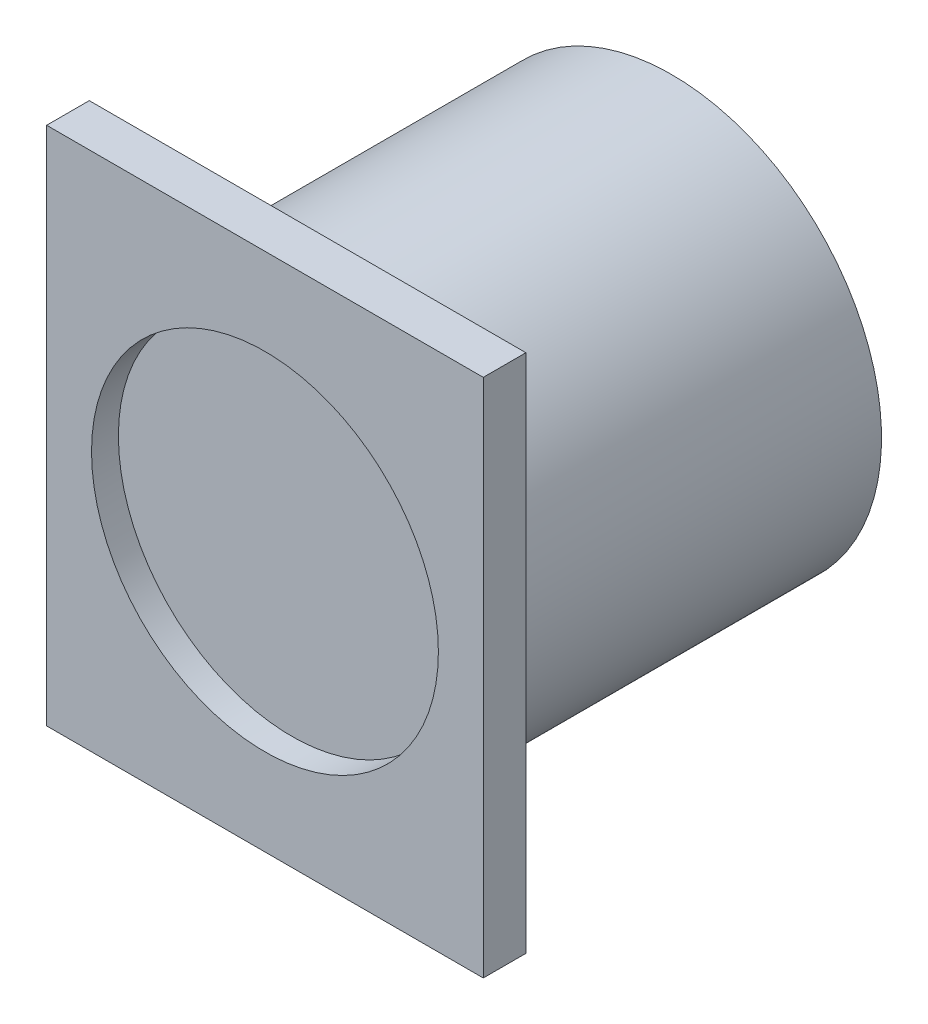
ISO-10303-21;
HEADER;
FILE_DESCRIPTION(('STEP AP214'),'2;1');
FILE_NAME('part.step','',(''),(''),'','','');
FILE_SCHEMA(('AUTOMOTIVE_DESIGN { 1 0 10303 214 1 1 1 1 }'));
ENDSEC;
DATA;
#1=APPLICATION_CONTEXT('core data for automotive mechanical design processes');
#2=APPLICATION_PROTOCOL_DEFINITION('international standard','automotive_design',2000,#1);
#3=PRODUCT_CONTEXT('',#1,'mechanical');
#4=PRODUCT('Part','Part','',(#3));
#5=PRODUCT_RELATED_PRODUCT_CATEGORY('part','',(#4));
#6=PRODUCT_DEFINITION_FORMATION('','',#4);
#7=PRODUCT_DEFINITION_CONTEXT('part definition',#1,'design');
#8=PRODUCT_DEFINITION('design','',#6,#7);
#9=PRODUCT_DEFINITION_SHAPE('','',#8);
#10=(LENGTH_UNIT() NAMED_UNIT(*) SI_UNIT(.MILLI.,.METRE.));
#11=(NAMED_UNIT(*) PLANE_ANGLE_UNIT() SI_UNIT($,.RADIAN.));
#12=(NAMED_UNIT(*) SI_UNIT($,.STERADIAN.) SOLID_ANGLE_UNIT());
#13=UNCERTAINTY_MEASURE_WITH_UNIT(LENGTH_MEASURE(1.E-05),#10,'distance_accuracy_value','');
#14=(GEOMETRIC_REPRESENTATION_CONTEXT(3) GLOBAL_UNCERTAINTY_ASSIGNED_CONTEXT((#13)) GLOBAL_UNIT_ASSIGNED_CONTEXT((#10,
#11,#12)) REPRESENTATION_CONTEXT('',''));
#15=CARTESIAN_POINT('',(0.,0.,0.));
#16=DIRECTION('',(0.,0.,1.));
#17=DIRECTION('',(1.,0.,0.));
#18=AXIS2_PLACEMENT_3D('',#15,#16,#17);
#19=CARTESIAN_POINT('',(0.,0.,0.9398));
#20=DIRECTION('',(0.,0.,1.));
#21=DIRECTION('',(1.,0.,0.));
#22=AXIS2_PLACEMENT_3D('',#19,#20,#21);
#23=PLANE('',#22);
#24=CARTESIAN_POINT('',(13.0048,15.494,0.9398));
#25=DIRECTION('',(0.,0.,1.));
#26=DIRECTION('',(1.,0.,0.));
#27=AXIS2_PLACEMENT_3D('',#24,#25,#26);
#28=CIRCLE('',#27,10.3313154429818);
#29=CARTESIAN_POINT('',(23.3361154429818,15.494,0.9398));
#30=VERTEX_POINT('',#29);
#31=EDGE_CURVE('E20',#30,#30,#28,.T.);
#32=ORIENTED_EDGE('',*,*,#31,.T.);
#33=EDGE_LOOP('',(#32));
#34=FACE_BOUND('',#33,.T.);
#35=ADVANCED_FACE('F17',(#34),#23,.T.);
#36=CARTESIAN_POINT('',(13.0048,15.494,2.54));
#37=DIRECTION('',(0.,0.,1.));
#38=DIRECTION('',(1.,0.,0.));
#39=AXIS2_PLACEMENT_3D('',#36,#37,#38);
#40=CYLINDRICAL_SURFACE('',#39,10.3313154429818);
#41=ORIENTED_EDGE('',*,*,#31,.F.);
#42=EDGE_LOOP('',(#41));
#43=FACE_BOUND('',#42,.T.);
#44=CARTESIAN_POINT('',(13.0048,15.494,2.54));
#45=DIRECTION('',(0.,0.,1.));
#46=DIRECTION('',(1.,0.,0.));
#47=AXIS2_PLACEMENT_3D('',#44,#45,#46);
#48=CIRCLE('',#47,10.3313154429818);
#49=CARTESIAN_POINT('',(23.3361154429818,15.494,2.54));
#50=VERTEX_POINT('',#49);
#51=EDGE_CURVE('E66',#50,#50,#48,.F.);
#52=ORIENTED_EDGE('',*,*,#51,.F.);
#53=EDGE_LOOP('',(#52));
#54=FACE_BOUND('',#53,.T.);
#55=ADVANCED_FACE('F92',(#43,#54),#40,.F.);
#56=CARTESIAN_POINT('',(0.,0.,2.54));
#57=DIRECTION('',(0.,0.,1.));
#58=DIRECTION('',(1.,0.,0.));
#59=AXIS2_PLACEMENT_3D('',#56,#57,#58);
#60=PLANE('',#59);
#61=ORIENTED_EDGE('',*,*,#51,.T.);
#62=EDGE_LOOP('',(#61));
#63=FACE_BOUND('',#62,.T.);
#64=DIRECTION('',(1.,0.,0.));
#65=VECTOR('',#64,1.);
#66=CARTESIAN_POINT('',(26.0096,30.988,2.54));
#67=LINE('',#66,#65);
#68=CARTESIAN_POINT('',(0.,30.988,2.54));
#69=VERTEX_POINT('',#68);
#70=CARTESIAN_POINT('',(26.0096,30.988,2.54));
#71=VERTEX_POINT('',#70);
#72=EDGE_CURVE('E63',#69,#71,#67,.T.);
#73=ORIENTED_EDGE('',*,*,#72,.F.);
#74=DIRECTION('',(0.,1.,0.));
#75=VECTOR('',#74,1.);
#76=CARTESIAN_POINT('',(0.,30.988,2.54));
#77=LINE('',#76,#75);
#78=CARTESIAN_POINT('',(0.,0.,2.54));
#79=VERTEX_POINT('',#78);
#80=EDGE_CURVE('E59',#79,#69,#77,.T.);
#81=ORIENTED_EDGE('',*,*,#80,.F.);
#82=DIRECTION('',(1.,0.,0.));
#83=VECTOR('',#82,1.);
#84=CARTESIAN_POINT('',(0.,0.,2.54));
#85=LINE('',#84,#83);
#86=CARTESIAN_POINT('',(26.0096,0.,2.54));
#87=VERTEX_POINT('',#86);
#88=EDGE_CURVE('E56',#87,#79,#85,.F.);
#89=ORIENTED_EDGE('',*,*,#88,.F.);
#90=DIRECTION('',(0.,1.,0.));
#91=VECTOR('',#90,1.);
#92=CARTESIAN_POINT('',(26.0096,0.,2.54));
#93=LINE('',#92,#91);
#94=EDGE_CURVE('E75',#71,#87,#93,.F.);
#95=ORIENTED_EDGE('',*,*,#94,.F.);
#96=EDGE_LOOP('',(#73,#81,#89,#95));
#97=FACE_BOUND('',#96,.T.);
#98=ADVANCED_FACE('F61',(#63,#97),#60,.T.);
#99=CARTESIAN_POINT('',(0.,30.988,0.));
#100=DIRECTION('',(-1.,0.,0.));
#101=DIRECTION('',(0.,0.,1.));
#102=AXIS2_PLACEMENT_3D('',#99,#100,#101);
#103=PLANE('',#102);
#104=DIRECTION('',(0.,0.,1.));
#105=VECTOR('',#104,1.);
#106=CARTESIAN_POINT('',(0.,30.988,0.));
#107=LINE('',#106,#105);
#108=CARTESIAN_POINT('',(0.,30.988,0.));
#109=VERTEX_POINT('',#108);
#110=EDGE_CURVE('E205',#109,#69,#107,.T.);
#111=ORIENTED_EDGE('',*,*,#110,.F.);
#112=DIRECTION('',(0.,1.,0.));
#113=VECTOR('',#112,1.);
#114=CARTESIAN_POINT('',(0.,0.,0.));
#115=LINE('',#114,#113);
#116=CARTESIAN_POINT('',(0.,0.,0.));
#117=VERTEX_POINT('',#116);
#118=EDGE_CURVE('E72',#109,#117,#115,.F.);
#119=ORIENTED_EDGE('',*,*,#118,.T.);
#120=DIRECTION('',(0.,0.,-1.));
#121=VECTOR('',#120,1.);
#122=CARTESIAN_POINT('',(0.,0.,0.));
#123=LINE('',#122,#121);
#124=EDGE_CURVE('E69',#79,#117,#123,.T.);
#125=ORIENTED_EDGE('',*,*,#124,.F.);
#126=ORIENTED_EDGE('',*,*,#80,.T.);
#127=EDGE_LOOP('',(#111,#119,#125,#126));
#128=FACE_BOUND('',#127,.T.);
#129=ADVANCED_FACE('F70',(#128),#103,.T.);
#130=CARTESIAN_POINT('',(0.,0.,0.));
#131=DIRECTION('',(0.,-1.,0.));
#132=DIRECTION('',(0.,0.,-1.));
#133=AXIS2_PLACEMENT_3D('',#130,#131,#132);
#134=PLANE('',#133);
#135=ORIENTED_EDGE('',*,*,#124,.T.);
#136=DIRECTION('',(1.,0.,0.));
#137=VECTOR('',#136,1.);
#138=CARTESIAN_POINT('',(0.,0.,0.));
#139=LINE('',#138,#137);
#140=CARTESIAN_POINT('',(26.0096,0.,0.));
#141=VERTEX_POINT('',#140);
#142=EDGE_CURVE('E209',#117,#141,#139,.T.);
#143=ORIENTED_EDGE('',*,*,#142,.T.);
#144=DIRECTION('',(0.,0.,-1.));
#145=VECTOR('',#144,1.);
#146=CARTESIAN_POINT('',(26.0096,0.,0.));
#147=LINE('',#146,#145);
#148=EDGE_CURVE('E78',#87,#141,#147,.T.);
#149=ORIENTED_EDGE('',*,*,#148,.F.);
#150=ORIENTED_EDGE('',*,*,#88,.T.);
#151=EDGE_LOOP('',(#135,#143,#149,#150));
#152=FACE_BOUND('',#151,.T.);
#153=ADVANCED_FACE('F77',(#152),#134,.T.);
#154=CARTESIAN_POINT('',(26.0096,0.,0.));
#155=DIRECTION('',(1.,0.,0.));
#156=DIRECTION('',(0.,0.,-1.));
#157=AXIS2_PLACEMENT_3D('',#154,#155,#156);
#158=PLANE('',#157);
#159=ORIENTED_EDGE('',*,*,#148,.T.);
#160=DIRECTION('',(0.,1.,0.));
#161=VECTOR('',#160,1.);
#162=CARTESIAN_POINT('',(26.0096,0.,0.));
#163=LINE('',#162,#161);
#164=CARTESIAN_POINT('',(26.0096,30.988,0.));
#165=VERTEX_POINT('',#164);
#166=EDGE_CURVE('E35',#141,#165,#163,.T.);
#167=ORIENTED_EDGE('',*,*,#166,.T.);
#168=DIRECTION('',(0.,0.,1.));
#169=VECTOR('',#168,1.);
#170=CARTESIAN_POINT('',(26.0096,30.988,0.));
#171=LINE('',#170,#169);
#172=EDGE_CURVE('E216',#71,#165,#171,.F.);
#173=ORIENTED_EDGE('',*,*,#172,.F.);
#174=ORIENTED_EDGE('',*,*,#94,.T.);
#175=EDGE_LOOP('',(#159,#167,#173,#174));
#176=FACE_BOUND('',#175,.T.);
#177=ADVANCED_FACE('F120',(#176),#158,.T.);
#178=CARTESIAN_POINT('',(26.0096,30.988,0.));
#179=DIRECTION('',(0.,1.,0.));
#180=DIRECTION('',(0.,0.,1.));
#181=AXIS2_PLACEMENT_3D('',#178,#179,#180);
#182=PLANE('',#181);
#183=ORIENTED_EDGE('',*,*,#172,.T.);
#184=DIRECTION('',(1.,0.,0.));
#185=VECTOR('',#184,1.);
#186=CARTESIAN_POINT('',(0.,30.988,0.));
#187=LINE('',#186,#185);
#188=EDGE_CURVE('E84',#165,#109,#187,.F.);
#189=ORIENTED_EDGE('',*,*,#188,.T.);
#190=ORIENTED_EDGE('',*,*,#110,.T.);
#191=ORIENTED_EDGE('',*,*,#72,.T.);
#192=EDGE_LOOP('',(#183,#189,#190,#191));
#193=FACE_BOUND('',#192,.T.);
#194=ADVANCED_FACE('F116',(#193),#182,.T.);
#195=CARTESIAN_POINT('',(0.,0.,-21.6916));
#196=DIRECTION('',(0.,0.,-1.));
#197=DIRECTION('',(-1.,0.,0.));
#198=AXIS2_PLACEMENT_3D('',#195,#196,#197);
#199=PLANE('',#198);
#200=CARTESIAN_POINT('',(13.0048,15.494,-21.6916));
#201=DIRECTION('',(0.,0.,-1.));
#202=DIRECTION('',(-1.,0.,0.));
#203=AXIS2_PLACEMENT_3D('',#200,#201,#202);
#204=CIRCLE('',#203,12.4968);
#205=CARTESIAN_POINT('',(0.508000000000003,15.494,-21.6916));
#206=VERTEX_POINT('',#205);
#207=EDGE_CURVE('E26',#206,#206,#204,.F.);
#208=ORIENTED_EDGE('',*,*,#207,.F.);
#209=EDGE_LOOP('',(#208));
#210=FACE_BOUND('',#209,.T.);
#211=ADVANCED_FACE('F109',(#210),#199,.T.);
#212=CARTESIAN_POINT('',(0.,0.,0.));
#213=DIRECTION('',(0.,0.,1.));
#214=DIRECTION('',(1.,0.,0.));
#215=AXIS2_PLACEMENT_3D('',#212,#213,#214);
#216=PLANE('',#215);
#217=CARTESIAN_POINT('',(13.0048,15.494,0.));
#218=DIRECTION('',(0.,0.,-1.));
#219=DIRECTION('',(-1.,0.,0.));
#220=AXIS2_PLACEMENT_3D('',#217,#218,#219);
#221=CIRCLE('',#220,12.4968);
#222=CARTESIAN_POINT('',(0.508000000000003,15.494,0.));
#223=VERTEX_POINT('',#222);
#224=EDGE_CURVE('E11',#223,#223,#221,.T.);
#225=ORIENTED_EDGE('',*,*,#224,.F.);
#226=EDGE_LOOP('',(#225));
#227=FACE_BOUND('',#226,.T.);
#228=ORIENTED_EDGE('',*,*,#166,.F.);
#229=ORIENTED_EDGE('',*,*,#142,.F.);
#230=ORIENTED_EDGE('',*,*,#118,.F.);
#231=ORIENTED_EDGE('',*,*,#188,.F.);
#232=EDGE_LOOP('',(#228,#229,#230,#231));
#233=FACE_BOUND('',#232,.T.);
#234=ADVANCED_FACE('F103',(#227,#233),#216,.F.);
#235=CARTESIAN_POINT('',(13.0048,15.494,0.));
#236=DIRECTION('',(0.,0.,-1.));
#237=DIRECTION('',(-1.,0.,0.));
#238=AXIS2_PLACEMENT_3D('',#235,#236,#237);
#239=CYLINDRICAL_SURFACE('',#238,12.4968);
#240=ORIENTED_EDGE('',*,*,#207,.T.);
#241=EDGE_LOOP('',(#240));
#242=FACE_BOUND('',#241,.T.);
#243=ORIENTED_EDGE('',*,*,#224,.T.);
#244=EDGE_LOOP('',(#243));
#245=FACE_BOUND('',#244,.T.);
#246=ADVANCED_FACE('F101',(#242,#245),#239,.T.);
#247=CLOSED_SHELL('',(#35,#55,#98,#129,#153,#177,#194,#211,#234,#246));
#248=MANIFOLD_SOLID_BREP('B1',#247);
#249=ADVANCED_BREP_SHAPE_REPRESENTATION('',(#18,#248),#14);
#250=SHAPE_DEFINITION_REPRESENTATION(#9,#249);
ENDSEC;
END-ISO-10303-21;
